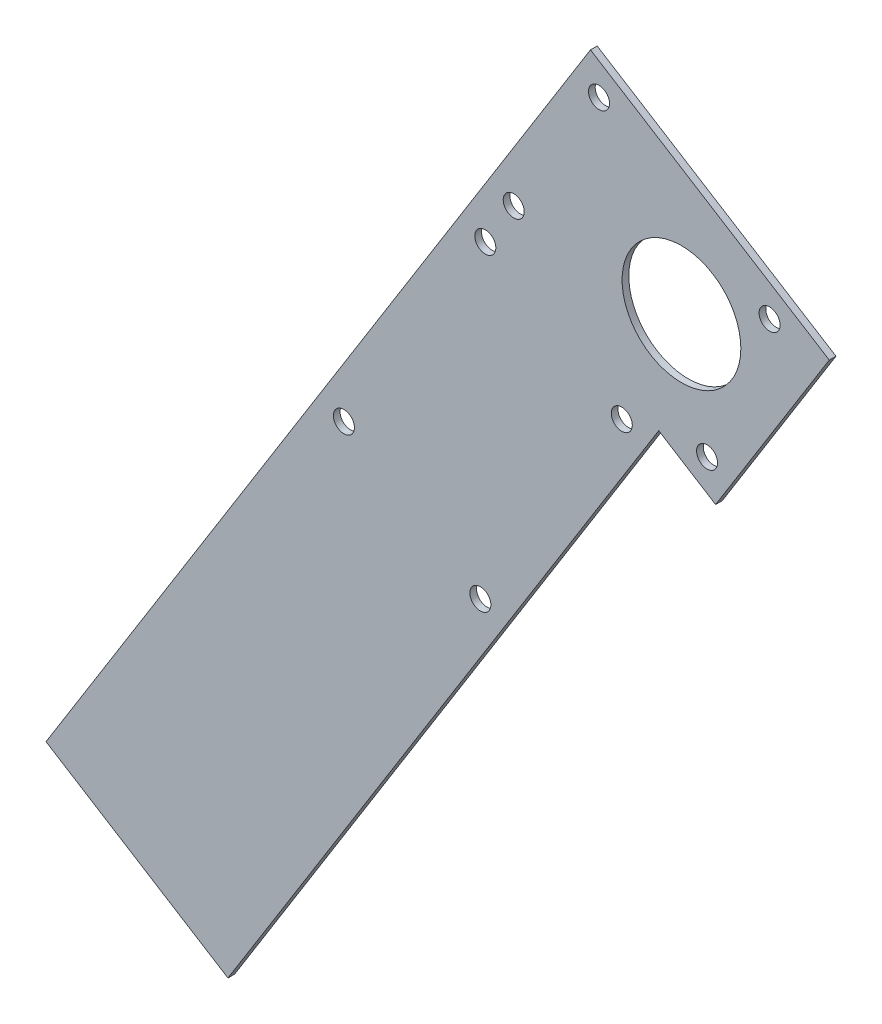
ISO-10303-21;
HEADER;
FILE_DESCRIPTION(('STEP AP214'),'2;1');
FILE_NAME('part.step','',(''),(''),'','','');
FILE_SCHEMA(('AUTOMOTIVE_DESIGN { 1 0 10303 214 1 1 1 1 }'));
ENDSEC;
DATA;
#1=APPLICATION_CONTEXT('core data for automotive mechanical design processes');
#2=APPLICATION_PROTOCOL_DEFINITION('international standard','automotive_design',2000,#1);
#3=PRODUCT_CONTEXT('',#1,'mechanical');
#4=PRODUCT('Part','Part','',(#3));
#5=PRODUCT_RELATED_PRODUCT_CATEGORY('part','',(#4));
#6=PRODUCT_DEFINITION_FORMATION('','',#4);
#7=PRODUCT_DEFINITION_CONTEXT('part definition',#1,'design');
#8=PRODUCT_DEFINITION('design','',#6,#7);
#9=PRODUCT_DEFINITION_SHAPE('','',#8);
#10=(LENGTH_UNIT() NAMED_UNIT(*) SI_UNIT(.MILLI.,.METRE.));
#11=(NAMED_UNIT(*) PLANE_ANGLE_UNIT() SI_UNIT($,.RADIAN.));
#12=(NAMED_UNIT(*) SI_UNIT($,.STERADIAN.) SOLID_ANGLE_UNIT());
#13=UNCERTAINTY_MEASURE_WITH_UNIT(LENGTH_MEASURE(1.E-05),#10,'distance_accuracy_value','');
#14=(GEOMETRIC_REPRESENTATION_CONTEXT(3) GLOBAL_UNCERTAINTY_ASSIGNED_CONTEXT((#13)) GLOBAL_UNIT_ASSIGNED_CONTEXT((#10,
#11,#12)) REPRESENTATION_CONTEXT('',''));
#15=CARTESIAN_POINT('',(0.,0.,0.));
#16=DIRECTION('',(0.,0.,1.));
#17=DIRECTION('',(1.,0.,0.));
#18=AXIS2_PLACEMENT_3D('',#15,#16,#17);
#19=CARTESIAN_POINT('',(14.1408265787321,-61.2506491696666,319.849499999996));
#20=DIRECTION('',(-0.848048096156436,0.529919264233189,0.));
#21=DIRECTION('',(-0.529919264233189,-0.848048096156436,0.));
#22=AXIS2_PLACEMENT_3D('',#19,#20,#21);
#23=PLANE('',#22);
#24=DIRECTION('',(-0.529919264233189,-0.848048096156436,0.));
#25=VECTOR('',#24,1.);
#26=CARTESIAN_POINT('',(14.1408265787321,-61.2506491696666,321.436999999996));
#27=LINE('',#26,#25);
#28=CARTESIAN_POINT('',(14.1408265787321,-61.2506491696666,321.436999999996));
#29=VERTEX_POINT('',#28);
#30=CARTESIAN_POINT('',(-87.8513112215195,-224.472188982129,321.436999999996));
#31=VERTEX_POINT('',#30);
#32=EDGE_CURVE('E121',#29,#31,#27,.T.);
#33=ORIENTED_EDGE('',*,*,#32,.T.);
#34=DIRECTION('',(0.,0.,1.));
#35=VECTOR('',#34,1.);
#36=CARTESIAN_POINT('',(-87.8513112215195,-224.472188982129,319.849499999996));
#37=LINE('',#36,#35);
#38=CARTESIAN_POINT('',(-87.8513112215195,-224.472188982129,319.849499999996));
#39=VERTEX_POINT('',#38);
#40=EDGE_CURVE('E11',#39,#31,#37,.T.);
#41=ORIENTED_EDGE('',*,*,#40,.F.);
#42=DIRECTION('',(-0.529919264233189,-0.848048096156436,0.));
#43=VECTOR('',#42,1.);
#44=CARTESIAN_POINT('',(14.1408265787321,-61.2506491696666,319.849499999996));
#45=LINE('',#44,#43);
#46=CARTESIAN_POINT('',(14.1408265787321,-61.2506491696666,319.849499999996));
#47=VERTEX_POINT('',#46);
#48=EDGE_CURVE('E132',#47,#39,#45,.T.);
#49=ORIENTED_EDGE('',*,*,#48,.F.);
#50=DIRECTION('',(0.,0.,1.));
#51=VECTOR('',#50,1.);
#52=CARTESIAN_POINT('',(14.1408265787321,-61.2506491696666,319.849499999996));
#53=LINE('',#52,#51);
#54=EDGE_CURVE('E117',#47,#29,#53,.T.);
#55=ORIENTED_EDGE('',*,*,#54,.T.);
#56=EDGE_LOOP('',(#33,#41,#49,#55));
#57=FACE_BOUND('',#56,.T.);
#58=ADVANCED_FACE('F37',(#57),#23,.F.);
#59=CARTESIAN_POINT('',(-87.8513112215195,-224.472188982129,319.849499999996));
#60=DIRECTION('',(0.529919264233189,0.848048096156436,0.));
#61=DIRECTION('',(-0.848048096156436,0.529919264233189,0.));
#62=AXIS2_PLACEMENT_3D('',#59,#60,#61);
#63=PLANE('',#62);
#64=DIRECTION('',(-0.848048096156436,0.529919264233189,0.));
#65=VECTOR('',#64,1.);
#66=CARTESIAN_POINT('',(-87.8513112215195,-224.472188982129,321.436999999996));
#67=LINE('',#66,#65);
#68=CARTESIAN_POINT('',(-130.932154506266,-197.552290359083,321.436999999996));
#69=VERTEX_POINT('',#68);
#70=EDGE_CURVE('E124',#31,#69,#67,.T.);
#71=ORIENTED_EDGE('',*,*,#70,.T.);
#72=DIRECTION('',(0.,0.,1.));
#73=VECTOR('',#72,1.);
#74=CARTESIAN_POINT('',(-130.932154506266,-197.552290359083,319.849499999996));
#75=LINE('',#74,#73);
#76=CARTESIAN_POINT('',(-130.932154506266,-197.552290359083,319.849499999996));
#77=VERTEX_POINT('',#76);
#78=EDGE_CURVE('E45',#77,#69,#75,.T.);
#79=ORIENTED_EDGE('',*,*,#78,.F.);
#80=DIRECTION('',(-0.848048096156436,0.529919264233189,0.));
#81=VECTOR('',#80,1.);
#82=CARTESIAN_POINT('',(-87.8513112215195,-224.472188982129,319.849499999996));
#83=LINE('',#82,#81);
#84=EDGE_CURVE('E90',#39,#77,#83,.T.);
#85=ORIENTED_EDGE('',*,*,#84,.F.);
#86=ORIENTED_EDGE('',*,*,#40,.T.);
#87=EDGE_LOOP('',(#71,#79,#85,#86));
#88=FACE_BOUND('',#87,.T.);
#89=ADVANCED_FACE('F157',(#88),#63,.F.);
#90=CARTESIAN_POINT('',(-130.932154506266,-197.552290359083,319.849499999996));
#91=DIRECTION('',(0.848048096156436,-0.529919264233189,0.));
#92=DIRECTION('',(0.52991926423319,0.848048096156436,0.));
#93=AXIS2_PLACEMENT_3D('',#90,#91,#92);
#94=PLANE('',#93);
#95=DIRECTION('',(0.52991926423319,0.848048096156436,0.));
#96=VECTOR('',#95,1.);
#97=CARTESIAN_POINT('',(-130.932154506266,-197.552290359083,321.436999999996));
#98=LINE('',#97,#96);
#99=CARTESIAN_POINT('',(-2.02011808296882,8.75009273812625,321.436999999996));
#100=VERTEX_POINT('',#99);
#101=EDGE_CURVE('E127',#69,#100,#98,.T.);
#102=ORIENTED_EDGE('',*,*,#101,.T.);
#103=DIRECTION('',(0.,0.,1.));
#104=VECTOR('',#103,1.);
#105=CARTESIAN_POINT('',(-2.02011808296882,8.75009273812625,319.849499999996));
#106=LINE('',#105,#104);
#107=CARTESIAN_POINT('',(-2.02011808296882,8.75009273812625,319.849499999996));
#108=VERTEX_POINT('',#107);
#109=EDGE_CURVE('E112',#108,#100,#106,.T.);
#110=ORIENTED_EDGE('',*,*,#109,.F.);
#111=DIRECTION('',(0.52991926423319,0.848048096156436,0.));
#112=VECTOR('',#111,1.);
#113=CARTESIAN_POINT('',(-130.932154506266,-197.552290359083,319.849499999996));
#114=LINE('',#113,#112);
#115=EDGE_CURVE('E103',#77,#108,#114,.T.);
#116=ORIENTED_EDGE('',*,*,#115,.F.);
#117=ORIENTED_EDGE('',*,*,#78,.T.);
#118=EDGE_LOOP('',(#102,#110,#116,#117));
#119=FACE_BOUND('',#118,.T.);
#120=ADVANCED_FACE('F138',(#119),#94,.F.);
#121=CARTESIAN_POINT('',(-2.02011808296882,8.75009273812625,319.849499999996));
#122=DIRECTION('',(-0.529919264233189,-0.848048096156436,0.));
#123=DIRECTION('',(0.848048096156436,-0.529919264233189,0.));
#124=AXIS2_PLACEMENT_3D('',#121,#122,#123);
#125=PLANE('',#124);
#126=DIRECTION('',(0.848048096156436,-0.529919264233189,0.));
#127=VECTOR('',#126,1.);
#128=CARTESIAN_POINT('',(-2.02011808296882,8.75009273812625,321.436999999996));
#129=LINE('',#128,#127);
#130=CARTESIAN_POINT('',(54.5234887282615,-26.5822742046216,321.436999999996));
#131=VERTEX_POINT('',#130);
#132=EDGE_CURVE('E111',#100,#131,#129,.T.);
#133=ORIENTED_EDGE('',*,*,#132,.T.);
#134=DIRECTION('',(0.,0.,1.));
#135=VECTOR('',#134,1.);
#136=CARTESIAN_POINT('',(54.5234887282615,-26.5822742046216,319.849499999996));
#137=LINE('',#136,#135);
#138=CARTESIAN_POINT('',(54.5234887282615,-26.5822742046216,319.849499999996));
#139=VERTEX_POINT('',#138);
#140=EDGE_CURVE('E108',#139,#131,#137,.T.);
#141=ORIENTED_EDGE('',*,*,#140,.F.);
#142=DIRECTION('',(0.848048096156436,-0.529919264233189,0.));
#143=VECTOR('',#142,1.);
#144=CARTESIAN_POINT('',(-2.02011808296882,8.75009273812625,319.849499999996));
#145=LINE('',#144,#143);
#146=EDGE_CURVE('E97',#108,#139,#145,.T.);
#147=ORIENTED_EDGE('',*,*,#146,.F.);
#148=ORIENTED_EDGE('',*,*,#109,.T.);
#149=EDGE_LOOP('',(#133,#141,#147,#148));
#150=FACE_BOUND('',#149,.T.);
#151=ADVANCED_FACE('F109',(#150),#125,.F.);
#152=CARTESIAN_POINT('',(54.5234887282615,-26.5822742046216,319.849499999996));
#153=DIRECTION('',(-0.848048096156436,0.529919264233189,0.));
#154=DIRECTION('',(-0.52991926423319,-0.848048096156436,0.));
#155=AXIS2_PLACEMENT_3D('',#152,#153,#154);
#156=PLANE('',#155);
#157=DIRECTION('',(-0.52991926423319,-0.848048096156436,0.));
#158=VECTOR('',#157,1.);
#159=CARTESIAN_POINT('',(54.5234887282615,-26.5822742046216,321.436999999996));
#160=LINE('',#159,#158);
#161=CARTESIAN_POINT('',(27.6035901052155,-69.6631174893686,321.436999999996));
#162=VERTEX_POINT('',#161);
#163=EDGE_CURVE('E76',#131,#162,#160,.T.);
#164=ORIENTED_EDGE('',*,*,#163,.T.);
#165=DIRECTION('',(0.,0.,1.));
#166=VECTOR('',#165,1.);
#167=CARTESIAN_POINT('',(27.6035901052155,-69.6631174893686,319.849499999996));
#168=LINE('',#167,#166);
#169=CARTESIAN_POINT('',(27.6035901052155,-69.6631174893686,319.849499999996));
#170=VERTEX_POINT('',#169);
#171=EDGE_CURVE('E113',#170,#162,#168,.T.);
#172=ORIENTED_EDGE('',*,*,#171,.F.);
#173=DIRECTION('',(-0.52991926423319,-0.848048096156436,0.));
#174=VECTOR('',#173,1.);
#175=CARTESIAN_POINT('',(54.5234887282615,-26.5822742046216,319.849499999996));
#176=LINE('',#175,#174);
#177=EDGE_CURVE('E101',#139,#170,#176,.T.);
#178=ORIENTED_EDGE('',*,*,#177,.F.);
#179=ORIENTED_EDGE('',*,*,#140,.T.);
#180=EDGE_LOOP('',(#164,#172,#178,#179));
#181=FACE_BOUND('',#180,.T.);
#182=ADVANCED_FACE('F115',(#181),#156,.F.);
#183=CARTESIAN_POINT('',(27.6035901052155,-69.6631174893686,319.849499999996));
#184=DIRECTION('',(0.529919264233193,0.848048096156434,0.));
#185=DIRECTION('',(-0.848048096156433,0.529919264233193,0.));
#186=AXIS2_PLACEMENT_3D('',#183,#184,#185);
#187=PLANE('',#186);
#188=DIRECTION('',(-0.848048096156433,0.529919264233193,0.));
#189=VECTOR('',#188,1.);
#190=CARTESIAN_POINT('',(27.6035901052155,-69.6631174893686,321.436999999996));
#191=LINE('',#190,#189);
#192=EDGE_CURVE('E82',#162,#29,#191,.T.);
#193=ORIENTED_EDGE('',*,*,#192,.T.);
#194=ORIENTED_EDGE('',*,*,#54,.F.);
#195=DIRECTION('',(-0.848048096156433,0.529919264233193,0.));
#196=VECTOR('',#195,1.);
#197=CARTESIAN_POINT('',(27.6035901052155,-69.6631174893686,319.849499999996));
#198=LINE('',#197,#196);
#199=EDGE_CURVE('E53',#170,#47,#198,.T.);
#200=ORIENTED_EDGE('',*,*,#199,.F.);
#201=ORIENTED_EDGE('',*,*,#171,.T.);
#202=EDGE_LOOP('',(#193,#194,#200,#201));
#203=FACE_BOUND('',#202,.T.);
#204=ADVANCED_FACE('F145',(#203),#187,.F.);
#205=CARTESIAN_POINT('',(2.48071965824622E-13,-2.64268395069716E-13,319.849499999996));
#206=DIRECTION('',(0.,0.,-1.));
#207=DIRECTION('',(0.,1.,0.));
#208=AXIS2_PLACEMENT_3D('',#205,#206,#207);
#209=PLANE('',#208);
#210=CARTESIAN_POINT('',(19.5231182051734,-34.6627468046712,319.849499999996));
#211=DIRECTION('',(0.,0.,-1.));
#212=DIRECTION('',(0.,1.,0.));
#213=AXIS2_PLACEMENT_3D('',#210,#211,#212);
#214=CIRCLE('',#213,14.0571693338688);
#215=CARTESIAN_POINT('',(19.5231182051734,-20.6055774708023,319.849499999996));
#216=VERTEX_POINT('',#215);
#217=EDGE_CURVE('E338',#216,#216,#214,.T.);
#218=ORIENTED_EDGE('',*,*,#217,.F.);
#219=EDGE_LOOP('',(#218));
#220=FACE_BOUND('',#219,.T.);
#221=CARTESIAN_POINT('',(5.39073384025798,-63.2707672523794,319.849499999996));
#222=DIRECTION('',(0.,0.,-1.));
#223=DIRECTION('',(0.,1.,0.));
#224=AXIS2_PLACEMENT_3D('',#221,#222,#223);
#225=CIRCLE('',#224,2.48919999999999);
#226=CARTESIAN_POINT('',(5.39073384025798,-60.7815672523795,319.849499999996));
#227=VERTEX_POINT('',#226);
#228=EDGE_CURVE('E343',#227,#227,#225,.T.);
#229=ORIENTED_EDGE('',*,*,#228,.F.);
#230=EDGE_LOOP('',(#229));
#231=FACE_BOUND('',#230,.T.);
#232=CARTESIAN_POINT('',(25.5834720223302,-60.9130247507867,319.849499999996));
#233=DIRECTION('',(0.,0.,-1.));
#234=DIRECTION('',(0.,1.,0.));
#235=AXIS2_PLACEMENT_3D('',#232,#233,#234);
#236=CIRCLE('',#235,2.48919999999999);
#237=CARTESIAN_POINT('',(25.5834720223302,-58.4238247507867,319.849499999996));
#238=VERTEX_POINT('',#237);
#239=EDGE_CURVE('E351',#238,#238,#236,.T.);
#240=ORIENTED_EDGE('',*,*,#239,.F.);
#241=EDGE_LOOP('',(#240));
#242=FACE_BOUND('',#241,.T.);
#243=CARTESIAN_POINT('',(40.3882905790219,-25.2374049593451,319.849499999996));
#244=DIRECTION('',(0.,0.,-1.));
#245=DIRECTION('',(0.,1.,0.));
#246=AXIS2_PLACEMENT_3D('',#243,#244,#245);
#247=CIRCLE('',#246,2.48919999999999);
#248=CARTESIAN_POINT('',(40.3882905790219,-22.7482049593452,319.849499999996));
#249=VERTEX_POINT('',#248);
#250=EDGE_CURVE('E357',#249,#249,#247,.T.);
#251=ORIENTED_EDGE('',*,*,#250,.F.);
#252=EDGE_LOOP('',(#251));
#253=FACE_BOUND('',#252,.T.);
#254=CARTESIAN_POINT('',(-4.28520614390145E-10,-2.39405485587605E-10,319.849499999996));
#255=DIRECTION('',(0.,0.,-1.));
#256=DIRECTION('',(0.,1.,0.));
#257=AXIS2_PLACEMENT_3D('',#254,#255,#256);
#258=CIRCLE('',#257,2.48919999999999);
#259=CARTESIAN_POINT('',(-4.28520614390145E-10,2.48919999976058,319.849499999996));
#260=VERTEX_POINT('',#259);
#261=EDGE_CURVE('E363',#260,#260,#258,.T.);
#262=ORIENTED_EDGE('',*,*,#261,.F.);
#263=EDGE_LOOP('',(#262));
#264=FACE_BOUND('',#263,.T.);
#265=CARTESIAN_POINT('',(-20.1899239677134,-32.3106324638003,319.849499999996));
#266=DIRECTION('',(0.,0.,-1.));
#267=DIRECTION('',(0.,1.,0.));
#268=AXIS2_PLACEMENT_3D('',#265,#266,#267);
#269=CIRCLE('',#268,2.48919999999999);
#270=CARTESIAN_POINT('',(-20.1899239677134,-29.8214324638003,319.849499999996));
#271=VERTEX_POINT('',#270);
#272=EDGE_CURVE('E369',#271,#271,#269,.T.);
#273=ORIENTED_EDGE('',*,*,#272,.F.);
#274=EDGE_LOOP('',(#273));
#275=FACE_BOUND('',#274,.T.);
#276=CARTESIAN_POINT('',(-26.9198986233028,-43.0808432850958,319.849499999996));
#277=DIRECTION('',(0.,0.,-1.));
#278=DIRECTION('',(0.,1.,0.));
#279=AXIS2_PLACEMENT_3D('',#276,#277,#278);
#280=CIRCLE('',#279,2.48919999999999);
#281=CARTESIAN_POINT('',(-26.9198986233028,-40.5916432850958,319.849499999996));
#282=VERTEX_POINT('',#281);
#283=EDGE_CURVE('E375',#282,#282,#280,.T.);
#284=ORIENTED_EDGE('',*,*,#283,.F.);
#285=EDGE_LOOP('',(#284));
#286=FACE_BOUND('',#285,.T.);
#287=CARTESIAN_POINT('',(-60.4038647868167,-96.6663905058146,319.849499999996));
#288=DIRECTION('',(0.,0.,-1.));
#289=DIRECTION('',(0.,1.,0.));
#290=AXIS2_PLACEMENT_3D('',#287,#288,#289);
#291=CIRCLE('',#290,2.48919999999999);
#292=CARTESIAN_POINT('',(-60.4038647868167,-94.1771905058146,319.849499999996));
#293=VERTEX_POINT('',#292);
#294=EDGE_CURVE('E381',#293,#293,#291,.T.);
#295=ORIENTED_EDGE('',*,*,#294,.F.);
#296=EDGE_LOOP('',(#295));
#297=FACE_BOUND('',#296,.T.);
#298=CARTESIAN_POINT('',(-28.093232323256,-116.856314473098,319.849499999996));
#299=DIRECTION('',(0.,0.,-1.));
#300=DIRECTION('',(0.,1.,0.));
#301=AXIS2_PLACEMENT_3D('',#298,#299,#300);
#302=CIRCLE('',#301,2.48919999999999);
#303=CARTESIAN_POINT('',(-28.093232323256,-114.367114473098,319.849499999996));
#304=VERTEX_POINT('',#303);
#305=EDGE_CURVE('E387',#304,#304,#302,.T.);
#306=ORIENTED_EDGE('',*,*,#305,.F.);
#307=EDGE_LOOP('',(#306));
#308=FACE_BOUND('',#307,.T.);
#309=ORIENTED_EDGE('',*,*,#48,.T.);
#310=ORIENTED_EDGE('',*,*,#84,.T.);
#311=ORIENTED_EDGE('',*,*,#115,.T.);
#312=ORIENTED_EDGE('',*,*,#146,.T.);
#313=ORIENTED_EDGE('',*,*,#177,.T.);
#314=ORIENTED_EDGE('',*,*,#199,.T.);
#315=EDGE_LOOP('',(#309,#310,#311,#312,#313,#314));
#316=FACE_BOUND('',#315,.T.);
#317=ADVANCED_FACE('F99',(#220,#231,#242,#253,#264,#275,#286,#297,#308,#316),#209,.T.);
#318=CARTESIAN_POINT('',(2.48746217808275E-13,-2.64753637859108E-13,321.436999999996));
#319=DIRECTION('',(0.,0.,-1.));
#320=DIRECTION('',(0.,1.,0.));
#321=AXIS2_PLACEMENT_3D('',#318,#319,#320);
#322=PLANE('',#321);
#323=CARTESIAN_POINT('',(19.5231182051734,-34.6627468046712,321.436999999996));
#324=DIRECTION('',(0.,0.,1.));
#325=DIRECTION('',(1.,0.,0.));
#326=AXIS2_PLACEMENT_3D('',#323,#324,#325);
#327=CIRCLE('',#326,14.0571693338688);
#328=CARTESIAN_POINT('',(33.5802875390423,-34.6627468046712,321.436999999996));
#329=VERTEX_POINT('',#328);
#330=EDGE_CURVE('E341',#329,#329,#327,.T.);
#331=ORIENTED_EDGE('',*,*,#330,.F.);
#332=EDGE_LOOP('',(#331));
#333=FACE_BOUND('',#332,.T.);
#334=CARTESIAN_POINT('',(5.39073384025798,-63.2707672523794,321.436999999996));
#335=DIRECTION('',(0.,0.,-1.));
#336=DIRECTION('',(0.,1.,0.));
#337=AXIS2_PLACEMENT_3D('',#334,#335,#336);
#338=CIRCLE('',#337,2.4892);
#339=CARTESIAN_POINT('',(5.39073384025798,-60.7815672523794,321.436999999996));
#340=VERTEX_POINT('',#339);
#341=EDGE_CURVE('E348',#340,#340,#338,.T.);
#342=ORIENTED_EDGE('',*,*,#341,.T.);
#343=EDGE_LOOP('',(#342));
#344=FACE_BOUND('',#343,.T.);
#345=CARTESIAN_POINT('',(25.5834720223302,-60.9130247507867,321.436999999996));
#346=DIRECTION('',(0.,0.,-1.));
#347=DIRECTION('',(0.,1.,0.));
#348=AXIS2_PLACEMENT_3D('',#345,#346,#347);
#349=CIRCLE('',#348,2.4892);
#350=CARTESIAN_POINT('',(25.5834720223302,-58.4238247507867,321.436999999996));
#351=VERTEX_POINT('',#350);
#352=EDGE_CURVE('E354',#351,#351,#349,.T.);
#353=ORIENTED_EDGE('',*,*,#352,.T.);
#354=EDGE_LOOP('',(#353));
#355=FACE_BOUND('',#354,.T.);
#356=CARTESIAN_POINT('',(40.3882905790219,-25.2374049593451,321.436999999996));
#357=DIRECTION('',(0.,0.,-1.));
#358=DIRECTION('',(0.,1.,0.));
#359=AXIS2_PLACEMENT_3D('',#356,#357,#358);
#360=CIRCLE('',#359,2.4892);
#361=CARTESIAN_POINT('',(40.3882905790219,-22.7482049593452,321.436999999996));
#362=VERTEX_POINT('',#361);
#363=EDGE_CURVE('E360',#362,#362,#360,.T.);
#364=ORIENTED_EDGE('',*,*,#363,.T.);
#365=EDGE_LOOP('',(#364));
#366=FACE_BOUND('',#365,.T.);
#367=CARTESIAN_POINT('',(-4.28520614390145E-10,-2.39405945219299E-10,321.436999999996));
#368=DIRECTION('',(0.,0.,-1.));
#369=DIRECTION('',(0.,1.,0.));
#370=AXIS2_PLACEMENT_3D('',#367,#368,#369);
#371=CIRCLE('',#370,2.4892);
#372=CARTESIAN_POINT('',(-4.28520614390145E-10,2.48919999976059,321.436999999996));
#373=VERTEX_POINT('',#372);
#374=EDGE_CURVE('E366',#373,#373,#371,.T.);
#375=ORIENTED_EDGE('',*,*,#374,.T.);
#376=EDGE_LOOP('',(#375));
#377=FACE_BOUND('',#376,.T.);
#378=CARTESIAN_POINT('',(-20.1899239677134,-32.3106324638003,321.436999999996));
#379=DIRECTION('',(0.,0.,-1.));
#380=DIRECTION('',(0.,1.,0.));
#381=AXIS2_PLACEMENT_3D('',#378,#379,#380);
#382=CIRCLE('',#381,2.4892);
#383=CARTESIAN_POINT('',(-20.1899239677134,-29.8214324638003,321.436999999996));
#384=VERTEX_POINT('',#383);
#385=EDGE_CURVE('E372',#384,#384,#382,.T.);
#386=ORIENTED_EDGE('',*,*,#385,.T.);
#387=EDGE_LOOP('',(#386));
#388=FACE_BOUND('',#387,.T.);
#389=CARTESIAN_POINT('',(-26.9198986233028,-43.0808432850958,321.436999999996));
#390=DIRECTION('',(0.,0.,-1.));
#391=DIRECTION('',(0.,1.,0.));
#392=AXIS2_PLACEMENT_3D('',#389,#390,#391);
#393=CIRCLE('',#392,2.4892);
#394=CARTESIAN_POINT('',(-26.9198986233028,-40.5916432850958,321.436999999996));
#395=VERTEX_POINT('',#394);
#396=EDGE_CURVE('E378',#395,#395,#393,.T.);
#397=ORIENTED_EDGE('',*,*,#396,.T.);
#398=EDGE_LOOP('',(#397));
#399=FACE_BOUND('',#398,.T.);
#400=CARTESIAN_POINT('',(-60.4038647868167,-96.6663905058146,321.436999999996));
#401=DIRECTION('',(0.,0.,-1.));
#402=DIRECTION('',(0.,1.,0.));
#403=AXIS2_PLACEMENT_3D('',#400,#401,#402);
#404=CIRCLE('',#403,2.4892);
#405=CARTESIAN_POINT('',(-60.4038647868167,-94.1771905058146,321.436999999996));
#406=VERTEX_POINT('',#405);
#407=EDGE_CURVE('E384',#406,#406,#404,.T.);
#408=ORIENTED_EDGE('',*,*,#407,.T.);
#409=EDGE_LOOP('',(#408));
#410=FACE_BOUND('',#409,.T.);
#411=CARTESIAN_POINT('',(-28.093232323256,-116.856314473098,321.436999999996));
#412=DIRECTION('',(0.,0.,-1.));
#413=DIRECTION('',(0.,1.,0.));
#414=AXIS2_PLACEMENT_3D('',#411,#412,#413);
#415=CIRCLE('',#414,2.4892);
#416=CARTESIAN_POINT('',(-28.093232323256,-114.367114473098,321.436999999996));
#417=VERTEX_POINT('',#416);
#418=EDGE_CURVE('E125',#417,#417,#415,.T.);
#419=ORIENTED_EDGE('',*,*,#418,.T.);
#420=EDGE_LOOP('',(#419));
#421=FACE_BOUND('',#420,.T.);
#422=ORIENTED_EDGE('',*,*,#32,.F.);
#423=ORIENTED_EDGE('',*,*,#192,.F.);
#424=ORIENTED_EDGE('',*,*,#163,.F.);
#425=ORIENTED_EDGE('',*,*,#132,.F.);
#426=ORIENTED_EDGE('',*,*,#101,.F.);
#427=ORIENTED_EDGE('',*,*,#70,.F.);
#428=EDGE_LOOP('',(#422,#423,#424,#425,#426,#427));
#429=FACE_BOUND('',#428,.T.);
#430=ADVANCED_FACE('F141',(#333,#344,#355,#366,#377,#388,#399,#410,#421,#429),#322,.F.);
#431=CARTESIAN_POINT('',(-28.093232323256,-116.856314473098,319.849499999996));
#432=DIRECTION('',(0.,0.,-1.));
#433=DIRECTION('',(0.,1.,0.));
#434=AXIS2_PLACEMENT_3D('',#431,#432,#433);
#435=CYLINDRICAL_SURFACE('',#434,2.48919999999999);
#436=ORIENTED_EDGE('',*,*,#418,.F.);
#437=EDGE_LOOP('',(#436));
#438=FACE_BOUND('',#437,.T.);
#439=ORIENTED_EDGE('',*,*,#305,.T.);
#440=EDGE_LOOP('',(#439));
#441=FACE_BOUND('',#440,.T.);
#442=ADVANCED_FACE('F187',(#438,#441),#435,.F.);
#443=CARTESIAN_POINT('',(-60.4038647868167,-96.6663905058146,319.849499999996));
#444=DIRECTION('',(0.,0.,-1.));
#445=DIRECTION('',(0.,1.,0.));
#446=AXIS2_PLACEMENT_3D('',#443,#444,#445);
#447=CYLINDRICAL_SURFACE('',#446,2.48919999999999);
#448=ORIENTED_EDGE('',*,*,#407,.F.);
#449=EDGE_LOOP('',(#448));
#450=FACE_BOUND('',#449,.T.);
#451=ORIENTED_EDGE('',*,*,#294,.T.);
#452=EDGE_LOOP('',(#451));
#453=FACE_BOUND('',#452,.T.);
#454=ADVANCED_FACE('F192',(#450,#453),#447,.F.);
#455=CARTESIAN_POINT('',(-26.9198986233028,-43.0808432850958,319.849499999996));
#456=DIRECTION('',(0.,0.,-1.));
#457=DIRECTION('',(0.,1.,0.));
#458=AXIS2_PLACEMENT_3D('',#455,#456,#457);
#459=CYLINDRICAL_SURFACE('',#458,2.48919999999999);
#460=ORIENTED_EDGE('',*,*,#396,.F.);
#461=EDGE_LOOP('',(#460));
#462=FACE_BOUND('',#461,.T.);
#463=ORIENTED_EDGE('',*,*,#283,.T.);
#464=EDGE_LOOP('',(#463));
#465=FACE_BOUND('',#464,.T.);
#466=ADVANCED_FACE('F205',(#462,#465),#459,.F.);
#467=CARTESIAN_POINT('',(-20.1899239677134,-32.3106324638003,319.849499999996));
#468=DIRECTION('',(0.,0.,-1.));
#469=DIRECTION('',(0.,1.,0.));
#470=AXIS2_PLACEMENT_3D('',#467,#468,#469);
#471=CYLINDRICAL_SURFACE('',#470,2.48919999999999);
#472=ORIENTED_EDGE('',*,*,#385,.F.);
#473=EDGE_LOOP('',(#472));
#474=FACE_BOUND('',#473,.T.);
#475=ORIENTED_EDGE('',*,*,#272,.T.);
#476=EDGE_LOOP('',(#475));
#477=FACE_BOUND('',#476,.T.);
#478=ADVANCED_FACE('F216',(#474,#477),#471,.F.);
#479=CARTESIAN_POINT('',(-4.28520614390145E-10,-2.39405485587605E-10,319.849499999996));
#480=DIRECTION('',(0.,0.,-1.));
#481=DIRECTION('',(0.,1.,0.));
#482=AXIS2_PLACEMENT_3D('',#479,#480,#481);
#483=CYLINDRICAL_SURFACE('',#482,2.48919999999999);
#484=ORIENTED_EDGE('',*,*,#374,.F.);
#485=EDGE_LOOP('',(#484));
#486=FACE_BOUND('',#485,.T.);
#487=ORIENTED_EDGE('',*,*,#261,.T.);
#488=EDGE_LOOP('',(#487));
#489=FACE_BOUND('',#488,.T.);
#490=ADVANCED_FACE('F227',(#486,#489),#483,.F.);
#491=CARTESIAN_POINT('',(40.3882905790219,-25.2374049593451,319.849499999996));
#492=DIRECTION('',(0.,0.,-1.));
#493=DIRECTION('',(0.,1.,0.));
#494=AXIS2_PLACEMENT_3D('',#491,#492,#493);
#495=CYLINDRICAL_SURFACE('',#494,2.48919999999999);
#496=ORIENTED_EDGE('',*,*,#363,.F.);
#497=EDGE_LOOP('',(#496));
#498=FACE_BOUND('',#497,.T.);
#499=ORIENTED_EDGE('',*,*,#250,.T.);
#500=EDGE_LOOP('',(#499));
#501=FACE_BOUND('',#500,.T.);
#502=ADVANCED_FACE('F238',(#498,#501),#495,.F.);
#503=CARTESIAN_POINT('',(25.5834720223302,-60.9130247507867,319.849499999996));
#504=DIRECTION('',(0.,0.,-1.));
#505=DIRECTION('',(0.,1.,0.));
#506=AXIS2_PLACEMENT_3D('',#503,#504,#505);
#507=CYLINDRICAL_SURFACE('',#506,2.48919999999999);
#508=ORIENTED_EDGE('',*,*,#352,.F.);
#509=EDGE_LOOP('',(#508));
#510=FACE_BOUND('',#509,.T.);
#511=ORIENTED_EDGE('',*,*,#239,.T.);
#512=EDGE_LOOP('',(#511));
#513=FACE_BOUND('',#512,.T.);
#514=ADVANCED_FACE('F249',(#510,#513),#507,.F.);
#515=CARTESIAN_POINT('',(5.39073384025798,-63.2707672523794,319.849499999996));
#516=DIRECTION('',(0.,0.,-1.));
#517=DIRECTION('',(0.,1.,0.));
#518=AXIS2_PLACEMENT_3D('',#515,#516,#517);
#519=CYLINDRICAL_SURFACE('',#518,2.48919999999999);
#520=ORIENTED_EDGE('',*,*,#341,.F.);
#521=EDGE_LOOP('',(#520));
#522=FACE_BOUND('',#521,.T.);
#523=ORIENTED_EDGE('',*,*,#228,.T.);
#524=EDGE_LOOP('',(#523));
#525=FACE_BOUND('',#524,.T.);
#526=ADVANCED_FACE('F260',(#522,#525),#519,.F.);
#527=CARTESIAN_POINT('',(19.5231182051734,-34.6627468046712,318.896999999996));
#528=DIRECTION('',(0.,0.,1.));
#529=DIRECTION('',(1.,0.,0.));
#530=AXIS2_PLACEMENT_3D('',#527,#528,#529);
#531=CYLINDRICAL_SURFACE('',#530,14.0571693338688);
#532=ORIENTED_EDGE('',*,*,#217,.T.);
#533=EDGE_LOOP('',(#532));
#534=FACE_BOUND('',#533,.T.);
#535=ORIENTED_EDGE('',*,*,#330,.T.);
#536=EDGE_LOOP('',(#535));
#537=FACE_BOUND('',#536,.T.);
#538=ADVANCED_FACE('F271',(#534,#537),#531,.F.);
#539=CLOSED_SHELL('',(#58,#89,#120,#151,#182,#204,#317,#430,#442,#454,#466,#478,#490,#502,#514,
#526,#538));
#540=MANIFOLD_SOLID_BREP('B2',#539);
#541=ADVANCED_BREP_SHAPE_REPRESENTATION('',(#18,#540),#14);
#542=SHAPE_DEFINITION_REPRESENTATION(#9,#541);
ENDSEC;
END-ISO-10303-21;
